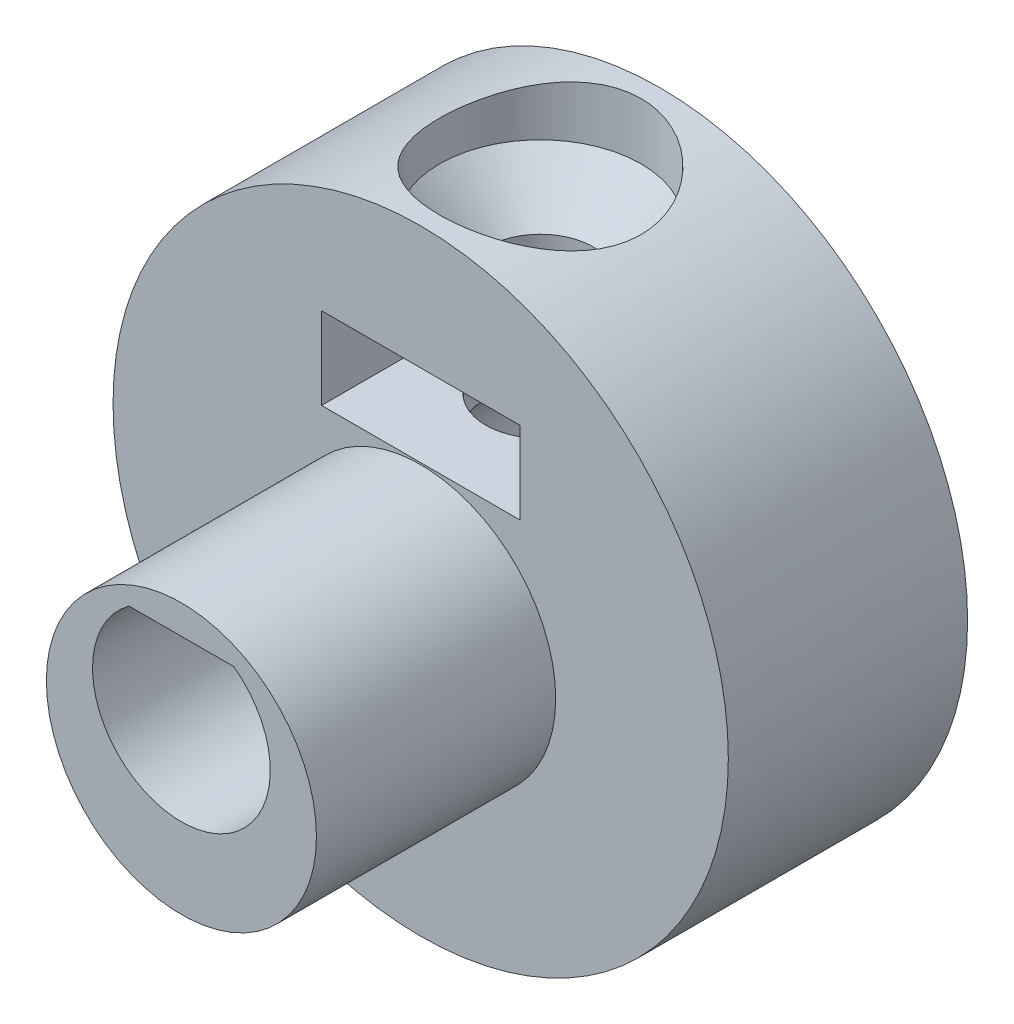
ISO-10303-21;
HEADER;
FILE_DESCRIPTION(('STEP AP214'),'2;1');
FILE_NAME('part.step','',(''),(''),'','','');
FILE_SCHEMA(('AUTOMOTIVE_DESIGN { 1 0 10303 214 1 1 1 1 }'));
ENDSEC;
DATA;
#1=APPLICATION_CONTEXT('core data for automotive mechanical design processes');
#2=APPLICATION_PROTOCOL_DEFINITION('international standard','automotive_design',2000,#1);
#3=PRODUCT_CONTEXT('',#1,'mechanical');
#4=PRODUCT('Part','Part','',(#3));
#5=PRODUCT_RELATED_PRODUCT_CATEGORY('part','',(#4));
#6=PRODUCT_DEFINITION_FORMATION('','',#4);
#7=PRODUCT_DEFINITION_CONTEXT('part definition',#1,'design');
#8=PRODUCT_DEFINITION('design','',#6,#7);
#9=PRODUCT_DEFINITION_SHAPE('','',#8);
#10=(LENGTH_UNIT() NAMED_UNIT(*) SI_UNIT(.MILLI.,.METRE.));
#11=(NAMED_UNIT(*) PLANE_ANGLE_UNIT() SI_UNIT($,.RADIAN.));
#12=(NAMED_UNIT(*) SI_UNIT($,.STERADIAN.) SOLID_ANGLE_UNIT());
#13=UNCERTAINTY_MEASURE_WITH_UNIT(LENGTH_MEASURE(1.E-05),#10,'distance_accuracy_value','');
#14=(GEOMETRIC_REPRESENTATION_CONTEXT(3) GLOBAL_UNCERTAINTY_ASSIGNED_CONTEXT((#13)) GLOBAL_UNIT_ASSIGNED_CONTEXT((#10,
#11,#12)) REPRESENTATION_CONTEXT('',''));
#15=CARTESIAN_POINT('',(0.,0.,0.));
#16=DIRECTION('',(0.,0.,1.));
#17=DIRECTION('',(1.,0.,0.));
#18=AXIS2_PLACEMENT_3D('',#15,#16,#17);
#19=CARTESIAN_POINT('',(0.,0.,7.));
#20=DIRECTION('',(0.,0.,-1.));
#21=DIRECTION('',(-1.,0.,0.));
#22=AXIS2_PLACEMENT_3D('',#19,#20,#21);
#23=CYLINDRICAL_SURFACE('',#22,9.);
#24=CARTESIAN_POINT('',(0.,0.,0.));
#25=DIRECTION('',(0.,0.,1.));
#26=DIRECTION('',(1.,0.,0.));
#27=AXIS2_PLACEMENT_3D('',#24,#25,#26);
#28=CIRCLE('',#27,9.);
#29=CARTESIAN_POINT('',(9.,0.,0.));
#30=VERTEX_POINT('',#29);
#31=EDGE_CURVE('E174',#30,#30,#28,.T.);
#32=ORIENTED_EDGE('',*,*,#31,.T.);
#33=EDGE_LOOP('',(#32));
#34=FACE_BOUND('',#33,.T.);
#35=CARTESIAN_POINT('',(0.,0.,7.));
#36=DIRECTION('',(0.,0.,1.));
#37=DIRECTION('',(1.,0.,0.));
#38=AXIS2_PLACEMENT_3D('',#35,#36,#37);
#39=CIRCLE('',#38,9.);
#40=CARTESIAN_POINT('',(9.,0.,7.));
#41=VERTEX_POINT('',#40);
#42=EDGE_CURVE('E173',#41,#41,#39,.T.);
#43=ORIENTED_EDGE('',*,*,#42,.F.);
#44=EDGE_LOOP('',(#43));
#45=FACE_BOUND('',#44,.T.);
#46=CARTESIAN_POINT('',(0.,9.,0.549999999999999));
#47=CARTESIAN_POINT('',(-0.161112811007833,9.00000007916726,0.54999977049622));
#48=CARTESIAN_POINT('',(-0.322225367097695,8.99563362612534,0.563241741495637));
#49=CARTESIAN_POINT('',(-0.639714101758699,8.97864445299604,0.615704018884045));
#50=CARTESIAN_POINT('',(-0.796089629614139,8.96602060394031,0.654927877580055));
#51=CARTESIAN_POINT('',(-1.09948106546237,8.9338903378811,0.757871411892351));
#52=CARTESIAN_POINT('',(-1.24651184971075,8.91439520081811,0.821550956193388));
#53=CARTESIAN_POINT('',(-1.5278071205778,8.87051846958465,0.971419731778327));
#54=CARTESIAN_POINT('',(-1.66206921513427,8.8461359624719,1.05761316948574));
#55=CARTESIAN_POINT('',(-1.91853006294912,8.7941396886032,1.25310842462129));
#56=CARTESIAN_POINT('',(-2.04023995666828,8.76645039345212,1.36303135956647));
#57=CARTESIAN_POINT('',(-2.26386852641767,8.71138271530213,1.6015442303979));
#58=CARTESIAN_POINT('',(-2.36578303447885,8.68400439892064,1.73013808755586));
#59=CARTESIAN_POINT('',(-2.54968005121513,8.63183317461184,2.00669741806998));
#60=CARTESIAN_POINT('',(-2.631033848366,8.60713263258936,2.1551000482303));
#61=CARTESIAN_POINT('',(-2.7674215834606,8.56425866139733,2.4644212261684));
#62=CARTESIAN_POINT('',(-2.82246325088888,8.54608331576893,2.62533608216929));
#63=CARTESIAN_POINT('',(-2.90284262108831,8.5191114809046,2.94956610485995));
#64=CARTESIAN_POINT('',(-2.92909390102087,8.51002738857174,3.11263016534748));
#65=CARTESIAN_POINT('',(-2.95400282249893,8.50141502328558,3.44108186491971));
#66=CARTESIAN_POINT('',(-2.95266865920405,8.50188391230561,3.60646879932786));
#67=CARTESIAN_POINT('',(-2.92315531108131,8.51207199397723,3.92714490348198));
#68=CARTESIAN_POINT('',(-2.89615979685309,8.52138329764801,4.0825582011845));
#69=CARTESIAN_POINT('',(-2.81801779864436,8.54754093512692,4.3865144345274));
#70=CARTESIAN_POINT('',(-2.76686851233264,8.564388143242,4.53505657077645));
#71=CARTESIAN_POINT('',(-2.64107962971505,8.60401589349913,4.82377855447869));
#72=CARTESIAN_POINT('',(-2.56608365084071,8.62688548385215,4.96379038525424));
#73=CARTESIAN_POINT('',(-2.39497765730034,8.67594291757715,5.22962012783346));
#74=CARTESIAN_POINT('',(-2.29886170733988,8.70213169285433,5.35543403455517));
#75=CARTESIAN_POINT('',(-2.08252564239994,8.75649002602446,5.59595905591665));
#76=CARTESIAN_POINT('',(-1.9613352172893,8.7846929094844,5.70979164547196));
#77=CARTESIAN_POINT('',(-1.70123660293618,8.83874511089937,5.91574266548827));
#78=CARTESIAN_POINT('',(-1.56232682670952,8.86459421768915,6.00785914889965));
#79=CARTESIAN_POINT('',(-1.26891586813371,8.9113464359935,6.16843942994575));
#80=CARTESIAN_POINT('',(-1.11428150287966,8.93220123179927,6.23667490593625));
#81=CARTESIAN_POINT('',(-0.794883071809848,8.96626492217254,6.34589534817572));
#82=CARTESIAN_POINT('',(-0.630122423815758,8.97947638101056,6.38688945434495));
#83=CARTESIAN_POINT('',(-0.302591104596022,8.99634333502784,6.43892343302898));
#84=CARTESIAN_POINT('',(-0.14002836040093,9.00037749384071,6.4511510100638));
#85=CARTESIAN_POINT('',(0.184854082755898,8.99956669104539,6.4486787042307));
#86=CARTESIAN_POINT('',(0.347173816925148,8.99472317243684,6.43398319750761));
#87=CARTESIAN_POINT('',(0.662255966733442,8.97695091784386,6.37902558440152));
#88=CARTESIAN_POINT('',(0.815158645178421,8.96425095616276,6.33948641414857));
#89=CARTESIAN_POINT('',(1.11210389443312,8.93227549763297,6.23686177314105));
#90=CARTESIAN_POINT('',(1.25614534057084,8.91299916813238,6.17377332065223));
#91=CARTESIAN_POINT('',(1.5354211202907,8.86921583836753,6.02403133094864));
#92=CARTESIAN_POINT('',(1.67033216354436,8.84458666910339,5.93681157481531));
#93=CARTESIAN_POINT('',(1.92399301280645,8.79289689700147,5.7419517805388));
#94=CARTESIAN_POINT('',(2.04273801157521,8.76583557487724,5.63430569096936));
#95=CARTESIAN_POINT('',(2.26611152862277,8.71083005315427,5.39606204597653));
#96=CARTESIAN_POINT('',(2.36989266209538,8.68289917663135,5.26466502468923));
#97=CARTESIAN_POINT('',(2.55402923310235,8.63053471650068,4.98571851729266));
#98=CARTESIAN_POINT('',(2.63438464853582,8.60610113619243,4.83816901594458));
#99=CARTESIAN_POINT('',(2.76897691698581,8.5637469605289,4.53115241548593));
#100=CARTESIAN_POINT('',(2.8232813381124,8.5458095461315,4.3717173997935));
#101=CARTESIAN_POINT('',(2.90404042015706,8.51870877247411,4.04524607888163));
#102=CARTESIAN_POINT('',(2.93050708321925,8.5095416320979,3.87821308193573));
#103=CARTESIAN_POINT('',(2.95392284015684,8.50143969717531,3.55021852780638));
#104=CARTESIAN_POINT('',(2.95227385305192,8.50201890479723,3.38936791272116));
#105=CARTESIAN_POINT('',(2.92293743458308,8.51214849552729,3.07036148285436));
#106=CARTESIAN_POINT('',(2.89525145705174,8.52169837773807,2.91220551811307));
#107=CARTESIAN_POINT('',(2.81560513690348,8.54833731543846,2.60586179994358));
#108=CARTESIAN_POINT('',(2.76408434262474,8.56528955565906,2.45754694744167));
#109=CARTESIAN_POINT('',(2.63858400839463,8.60477668462918,2.17155138978166));
#110=CARTESIAN_POINT('',(2.56459959011712,8.6273127858054,2.03387300265289));
#111=CARTESIAN_POINT('',(2.39260662902096,8.67662082423234,1.76672860818154));
#112=CARTESIAN_POINT('',(2.29371189186674,8.70353192207768,1.63785896591296));
#113=CARTESIAN_POINT('',(2.07622026061195,8.757959794638,1.39809096014739));
#114=CARTESIAN_POINT('',(1.95761788013916,8.78547673615692,1.28719761806815));
#115=CARTESIAN_POINT('',(1.69877526990235,8.83924483002503,1.08237856757061));
#116=CARTESIAN_POINT('',(1.55789411359646,8.86541078357923,0.989237760328904));
#117=CARTESIAN_POINT('',(1.2616242432928,8.91239325037381,0.828068321744328));
#118=CARTESIAN_POINT('',(1.10623981158641,8.93321133587649,0.760032307070647));
#119=CARTESIAN_POINT('',(0.794270731922598,8.9661780470715,0.654437448742746));
#120=CARTESIAN_POINT('',(0.63823247068608,8.97874409959837,0.615395259678429));
#121=CARTESIAN_POINT('',(0.32146191826884,8.99565399031255,0.563179941588874));
#122=CARTESIAN_POINT('',(0.160730832279097,8.99999992102044,0.550000228959653));
#123=CARTESIAN_POINT('',(0.,9.,0.549999999999999));
#124=B_SPLINE_CURVE_WITH_KNOTS('',3,(#46,#47,#48,#49,#50,#51,#52,#53,#54,#55,#56,#57,#58,#59,
#60,#61,#62,#63,#64,#65,#66,#67,#68,#69,#70,#71,#72,#73,#74,#75,#76,#77,#78,#79,#80,#81,#82,#83,
#84,#85,#86,#87,#88,#89,#90,#91,#92,#93,#94,#95,#96,#97,#98,#99,#100,#101,#102,#103,#104,#105,
#106,#107,#108,#109,#110,#111,#112,#113,#114,#115,#116,#117,#118,#119,#120,#121,#122,#123),
.UNSPECIFIED.,.T.,.F.,(4,2,2,2,2,2,2,2,2,2,2,2,2,2,2,2,2,2,2,2,2,2,2,2,2,2,2,2,2,2,2,2,2,2,2,2,
2,2,4),(0.,0.482747140063402,0.96556029611949,1.44758452715671,1.92969888255228,
2.42642310752843,2.92325180595637,3.43381151793208,3.94422115493364,4.43791863221509,
4.93146944259518,5.40330572496709,5.87519676344565,6.3545006419706,6.83393939077008,
7.33752888768181,7.84116351888875,8.34948958610246,8.85764501546994,9.34442072089788,
9.83111731161476,10.3042684747151,10.7774795670242,11.2629049562201,11.7484743808197,
12.2553370457081,12.7622001887922,13.2677414830955,13.7730647257241,14.2532683122651,
14.7334450871753,15.2050995694947,15.6768565522868,16.1686313865921,16.6605433552022,
17.1707592583502,17.6808249869457,18.1625502375705,18.6441528433309),.UNSPECIFIED.);
#125=CARTESIAN_POINT('',(0.,9.,0.549999999999999));
#126=VERTEX_POINT('',#125);
#127=EDGE_CURVE('E167',#126,#126,#124,.T.);
#128=ORIENTED_EDGE('',*,*,#127,.F.);
#129=EDGE_LOOP('',(#128));
#130=FACE_BOUND('',#129,.T.);
#131=ADVANCED_FACE('F39',(#34,#45,#130),#23,.T.);
#132=CARTESIAN_POINT('',(0.,3.,3.5));
#133=DIRECTION('',(0.,-1.,0.));
#134=DIRECTION('',(0.,0.,1.));
#135=AXIS2_PLACEMENT_3D('',#132,#133,#134);
#136=CONICAL_SURFACE('',#135,1.6,0.0174532925199433);
#137=CARTESIAN_POINT('',(0.,5.94288903149112,3.5));
#138=DIRECTION('',(0.,1.,0.));
#139=DIRECTION('',(0.,0.,1.));
#140=AXIS2_PLACEMENT_3D('',#137,#138,#139);
#141=CIRCLE('',#140,1.54863168087878);
#142=CARTESIAN_POINT('',(0.,5.94288903149112,5.04863168087878));
#143=VERTEX_POINT('',#142);
#144=EDGE_CURVE('E48',#143,#143,#141,.T.);
#145=ORIENTED_EDGE('',*,*,#144,.T.);
#146=EDGE_LOOP('',(#145));
#147=FACE_BOUND('',#146,.T.);
#148=CARTESIAN_POINT('',(0.,5.4,3.5));
#149=DIRECTION('',(0.,1.,0.));
#150=DIRECTION('',(0.,0.,1.));
#151=AXIS2_PLACEMENT_3D('',#148,#149,#150);
#152=CIRCLE('',#151,1.55810784417228);
#153=CARTESIAN_POINT('',(0.,5.4,5.05810784417228));
#154=VERTEX_POINT('',#153);
#155=EDGE_CURVE('E228',#154,#154,#152,.T.);
#156=ORIENTED_EDGE('',*,*,#155,.F.);
#157=EDGE_LOOP('',(#156));
#158=FACE_BOUND('',#157,.T.);
#159=ADVANCED_FACE('F165',(#147,#158),#136,.F.);
#160=CARTESIAN_POINT('',(0.,0.,7.));
#161=DIRECTION('',(0.,0.,1.));
#162=DIRECTION('',(1.,0.,0.));
#163=AXIS2_PLACEMENT_3D('',#160,#161,#162);
#164=PLANE('',#163);
#165=CARTESIAN_POINT('',(0.,-1.,7.));
#166=DIRECTION('',(0.,0.,1.));
#167=DIRECTION('',(1.,0.,0.));
#168=AXIS2_PLACEMENT_3D('',#165,#166,#167);
#169=CIRCLE('',#168,3.95);
#170=CARTESIAN_POINT('',(3.95,-1.,7.));
#171=VERTEX_POINT('',#170);
#172=EDGE_CURVE('E266',#171,#171,#169,.T.);
#173=ORIENTED_EDGE('',*,*,#172,.F.);
#174=EDGE_LOOP('',(#173));
#175=FACE_BOUND('',#174,.T.);
#176=DIRECTION('',(0.,1.,0.));
#177=VECTOR('',#176,1.);
#178=CARTESIAN_POINT('',(-2.9,3.,7.));
#179=LINE('',#178,#177);
#180=CARTESIAN_POINT('',(-2.9,3.,7.));
#181=VERTEX_POINT('',#180);
#182=CARTESIAN_POINT('',(-2.9,5.4,7.));
#183=VERTEX_POINT('',#182);
#184=EDGE_CURVE('E219',#181,#183,#179,.T.);
#185=ORIENTED_EDGE('',*,*,#184,.T.);
#186=DIRECTION('',(1.,0.,0.));
#187=VECTOR('',#186,1.);
#188=CARTESIAN_POINT('',(2.9,5.4,7.));
#189=LINE('',#188,#187);
#190=CARTESIAN_POINT('',(2.9,5.4,7.));
#191=VERTEX_POINT('',#190);
#192=EDGE_CURVE('E259',#183,#191,#189,.T.);
#193=ORIENTED_EDGE('',*,*,#192,.T.);
#194=DIRECTION('',(0.,-1.,0.));
#195=VECTOR('',#194,1.);
#196=CARTESIAN_POINT('',(2.9,3.,7.));
#197=LINE('',#196,#195);
#198=CARTESIAN_POINT('',(2.9,3.,7.));
#199=VERTEX_POINT('',#198);
#200=EDGE_CURVE('E255',#191,#199,#197,.T.);
#201=ORIENTED_EDGE('',*,*,#200,.T.);
#202=DIRECTION('',(-1.,0.,0.));
#203=VECTOR('',#202,1.);
#204=CARTESIAN_POINT('',(2.9,3.,7.));
#205=LINE('',#204,#203);
#206=EDGE_CURVE('E234',#199,#181,#205,.T.);
#207=ORIENTED_EDGE('',*,*,#206,.T.);
#208=EDGE_LOOP('',(#185,#193,#201,#207));
#209=FACE_BOUND('',#208,.T.);
#210=ORIENTED_EDGE('',*,*,#42,.T.);
#211=EDGE_LOOP('',(#210));
#212=FACE_BOUND('',#211,.T.);
#213=ADVANCED_FACE('F184',(#175,#209,#212),#164,.T.);
#214=CARTESIAN_POINT('',(0.,0.,0.));
#215=DIRECTION('',(0.,0.,1.));
#216=DIRECTION('',(1.,0.,0.));
#217=AXIS2_PLACEMENT_3D('',#214,#215,#216);
#218=PLANE('',#217);
#219=DIRECTION('',(1.,0.,0.));
#220=VECTOR('',#219,1.);
#221=CARTESIAN_POINT('',(1.53297097167559,2.1,0.));
#222=LINE('',#221,#220);
#223=CARTESIAN_POINT('',(-1.53297097167559,2.1,0.));
#224=VERTEX_POINT('',#223);
#225=CARTESIAN_POINT('',(1.53297097167559,2.1,0.));
#226=VERTEX_POINT('',#225);
#227=EDGE_CURVE('E122',#224,#226,#222,.T.);
#228=ORIENTED_EDGE('',*,*,#227,.F.);
#229=CARTESIAN_POINT('',(0.,0.,0.));
#230=DIRECTION('',(0.,0.,-1.));
#231=DIRECTION('',(-1.,0.,0.));
#232=AXIS2_PLACEMENT_3D('',#229,#230,#231);
#233=CIRCLE('',#232,2.6);
#234=EDGE_CURVE('E55',#226,#224,#233,.T.);
#235=ORIENTED_EDGE('',*,*,#234,.F.);
#236=EDGE_LOOP('',(#228,#235));
#237=FACE_BOUND('',#236,.T.);
#238=DIRECTION('',(1.,0.,0.));
#239=VECTOR('',#238,1.);
#240=CARTESIAN_POINT('',(2.9,5.4,0.));
#241=LINE('',#240,#239);
#242=CARTESIAN_POINT('',(-2.9,5.4,0.));
#243=VERTEX_POINT('',#242);
#244=CARTESIAN_POINT('',(2.9,5.4,0.));
#245=VERTEX_POINT('',#244);
#246=EDGE_CURVE('E226',#243,#245,#241,.T.);
#247=ORIENTED_EDGE('',*,*,#246,.F.);
#248=DIRECTION('',(0.,1.,0.));
#249=VECTOR('',#248,1.);
#250=CARTESIAN_POINT('',(-2.9,3.,0.));
#251=LINE('',#250,#249);
#252=CARTESIAN_POINT('',(-2.9,3.,0.));
#253=VERTEX_POINT('',#252);
#254=EDGE_CURVE('E223',#253,#243,#251,.T.);
#255=ORIENTED_EDGE('',*,*,#254,.F.);
#256=DIRECTION('',(-1.,0.,0.));
#257=VECTOR('',#256,1.);
#258=CARTESIAN_POINT('',(2.9,3.,0.));
#259=LINE('',#258,#257);
#260=CARTESIAN_POINT('',(2.9,3.,0.));
#261=VERTEX_POINT('',#260);
#262=EDGE_CURVE('E210',#261,#253,#259,.T.);
#263=ORIENTED_EDGE('',*,*,#262,.F.);
#264=DIRECTION('',(0.,-1.,0.));
#265=VECTOR('',#264,1.);
#266=CARTESIAN_POINT('',(2.9,3.,0.));
#267=LINE('',#266,#265);
#268=EDGE_CURVE('E220',#245,#261,#267,.T.);
#269=ORIENTED_EDGE('',*,*,#268,.F.);
#270=EDGE_LOOP('',(#247,#255,#263,#269));
#271=FACE_BOUND('',#270,.T.);
#272=ORIENTED_EDGE('',*,*,#31,.F.);
#273=EDGE_LOOP('',(#272));
#274=FACE_BOUND('',#273,.T.);
#275=ADVANCED_FACE('F180',(#237,#271,#274),#218,.F.);
#276=CARTESIAN_POINT('',(-2.9,3.,7.));
#277=DIRECTION('',(-1.,0.,0.));
#278=DIRECTION('',(0.,0.,1.));
#279=AXIS2_PLACEMENT_3D('',#276,#277,#278);
#280=PLANE('',#279);
#281=ORIENTED_EDGE('',*,*,#254,.T.);
#282=DIRECTION('',(0.,0.,-1.));
#283=VECTOR('',#282,1.);
#284=CARTESIAN_POINT('',(-2.9,5.4,7.));
#285=LINE('',#284,#283);
#286=EDGE_CURVE('E242',#183,#243,#285,.T.);
#287=ORIENTED_EDGE('',*,*,#286,.F.);
#288=ORIENTED_EDGE('',*,*,#184,.F.);
#289=DIRECTION('',(0.,0.,-1.));
#290=VECTOR('',#289,1.);
#291=CARTESIAN_POINT('',(-2.9,3.,7.));
#292=LINE('',#291,#290);
#293=EDGE_CURVE('E213',#181,#253,#292,.T.);
#294=ORIENTED_EDGE('',*,*,#293,.T.);
#295=EDGE_LOOP('',(#281,#287,#288,#294));
#296=FACE_BOUND('',#295,.T.);
#297=ADVANCED_FACE('F183',(#296),#280,.F.);
#298=CARTESIAN_POINT('',(2.9,3.,7.));
#299=DIRECTION('',(0.,-1.,0.));
#300=DIRECTION('',(0.,0.,-1.));
#301=AXIS2_PLACEMENT_3D('',#298,#299,#300);
#302=PLANE('',#301);
#303=CARTESIAN_POINT('',(0.,3.,3.5));
#304=DIRECTION('',(0.,1.,0.));
#305=DIRECTION('',(0.,0.,1.));
#306=AXIS2_PLACEMENT_3D('',#303,#304,#305);
#307=CIRCLE('',#306,1.6);
#308=CARTESIAN_POINT('',(0.,3.,5.1));
#309=VERTEX_POINT('',#308);
#310=EDGE_CURVE('E207',#309,#309,#307,.T.);
#311=ORIENTED_EDGE('',*,*,#310,.F.);
#312=EDGE_LOOP('',(#311));
#313=FACE_BOUND('',#312,.T.);
#314=ORIENTED_EDGE('',*,*,#262,.T.);
#315=ORIENTED_EDGE('',*,*,#293,.F.);
#316=ORIENTED_EDGE('',*,*,#206,.F.);
#317=DIRECTION('',(0.,0.,-1.));
#318=VECTOR('',#317,1.);
#319=CARTESIAN_POINT('',(2.9,3.,7.));
#320=LINE('',#319,#318);
#321=EDGE_CURVE('E215',#199,#261,#320,.T.);
#322=ORIENTED_EDGE('',*,*,#321,.T.);
#323=EDGE_LOOP('',(#314,#315,#316,#322));
#324=FACE_BOUND('',#323,.T.);
#325=ADVANCED_FACE('F191',(#313,#324),#302,.F.);
#326=CARTESIAN_POINT('',(2.9,3.,7.));
#327=DIRECTION('',(1.,0.,0.));
#328=DIRECTION('',(0.,0.,-1.));
#329=AXIS2_PLACEMENT_3D('',#326,#327,#328);
#330=PLANE('',#329);
#331=ORIENTED_EDGE('',*,*,#268,.T.);
#332=ORIENTED_EDGE('',*,*,#321,.F.);
#333=ORIENTED_EDGE('',*,*,#200,.F.);
#334=DIRECTION('',(0.,0.,-1.));
#335=VECTOR('',#334,1.);
#336=CARTESIAN_POINT('',(2.9,5.4,7.));
#337=LINE('',#336,#335);
#338=EDGE_CURVE('E240',#191,#245,#337,.T.);
#339=ORIENTED_EDGE('',*,*,#338,.T.);
#340=EDGE_LOOP('',(#331,#332,#333,#339));
#341=FACE_BOUND('',#340,.T.);
#342=ADVANCED_FACE('F196',(#341),#330,.F.);
#343=CARTESIAN_POINT('',(2.9,5.4,7.));
#344=DIRECTION('',(0.,1.,0.));
#345=DIRECTION('',(0.,0.,1.));
#346=AXIS2_PLACEMENT_3D('',#343,#344,#345);
#347=PLANE('',#346);
#348=ORIENTED_EDGE('',*,*,#155,.T.);
#349=EDGE_LOOP('',(#348));
#350=FACE_BOUND('',#349,.T.);
#351=ORIENTED_EDGE('',*,*,#246,.T.);
#352=ORIENTED_EDGE('',*,*,#338,.F.);
#353=ORIENTED_EDGE('',*,*,#192,.F.);
#354=ORIENTED_EDGE('',*,*,#286,.T.);
#355=EDGE_LOOP('',(#351,#352,#353,#354));
#356=FACE_BOUND('',#355,.T.);
#357=ADVANCED_FACE('F193',(#350,#356),#347,.F.);
#358=CARTESIAN_POINT('',(0.,3.,3.5));
#359=DIRECTION('',(0.,1.,0.));
#360=DIRECTION('',(0.,0.,1.));
#361=AXIS2_PLACEMENT_3D('',#358,#359,#360);
#362=CONICAL_SURFACE('',#361,1.6,0.0174532925199433);
#363=CARTESIAN_POINT('',(-1.29899889188882,2.25224374321955,4.41159498036883));
#364=CARTESIAN_POINT('',(-1.32529165431759,2.23708154011111,4.37364772010008));
#365=CARTESIAN_POINT('',(-1.34999117940577,2.22222007099547,4.33450834879584));
#366=CARTESIAN_POINT('',(-1.39607472859892,2.193560949725,4.25385868117236));
#367=CARTESIAN_POINT('',(-1.41745289154597,2.17976519931486,4.21234436650791));
#368=CARTESIAN_POINT('',(-1.47641579831923,2.14066239412542,4.08417181398737));
#369=CARTESIAN_POINT('',(-1.50864564564679,2.11775085211648,3.99414606408818));
#370=CARTESIAN_POINT('',(-1.55094764478245,2.08688200923848,3.83037630681194));
#371=CARTESIAN_POINT('',(-1.56448903050259,2.07665077013112,3.75794198569285));
#372=CARTESIAN_POINT('',(-1.58143943046514,2.06377602516573,3.61145008782872));
#373=CARTESIAN_POINT('',(-1.58488772820832,2.06110310282041,3.53739993766193));
#374=CARTESIAN_POINT('',(-1.58181370413459,2.06345816193232,3.40173737158732));
#375=CARTESIAN_POINT('',(-1.57682189512963,2.06730429099622,3.34006097809845));
#376=CARTESIAN_POINT('',(-1.55988407897795,2.08011365641698,3.21816430050291));
#377=CARTESIAN_POINT('',(-1.54792987145782,2.08908292661326,3.15794582079964));
#378=CARTESIAN_POINT('',(-1.5100856291588,2.11670188305626,3.0114209362597));
#379=CARTESIAN_POINT('',(-1.48025011876776,2.13793615633245,2.92660653463172));
#380=CARTESIAN_POINT('',(-1.40768206888462,2.18639588599553,2.76438219776849));
#381=CARTESIAN_POINT('',(-1.36490905135751,2.21364007232302,2.68699652090901));
#382=CARTESIAN_POINT('',(-1.27069770003565,2.26894728553857,2.545295470627));
#383=CARTESIAN_POINT('',(-1.21992672611327,2.29686503791386,2.48047628161313));
#384=CARTESIAN_POINT('',(-1.10927853077408,2.35230719826049,2.35978872465429));
#385=CARTESIAN_POINT('',(-1.04946048459482,2.37983297534036,2.30386671387855));
#386=CARTESIAN_POINT('',(-0.985350042403645,2.40605180616194,2.25259586208519));
#387=B_SPLINE_CURVE_WITH_KNOTS('',3,(#363,#364,#365,#366,#367,#368,#369,#370,#371,#372,#373,
#374,#375,#376,#377,#378,#379,#380,#381,#382,#383,#384,#385,#386),.UNSPECIFIED.,.F.,.F.,(4,2,2,
2,2,2,2,2,2,2,2,4),(0.,0.14567555687697,0.291605334645399,0.584466931415316,0.806697055308567,
1.02806107533898,1.2134198288775,1.39899734232891,1.67446358398311,1.95080076170907,
2.21068891932228,2.46894536132098),.UNSPECIFIED.);
#388=CARTESIAN_POINT('',(-1.53297097167559,2.1,3.8999702529351));
#389=VERTEX_POINT('',#388);
#390=CARTESIAN_POINT('',(-1.53297097167559,2.1,3.1000297470649));
#391=VERTEX_POINT('',#390);
#392=EDGE_CURVE('E109',#389,#391,#387,.T.);
#393=ORIENTED_EDGE('',*,*,#392,.T.);
#394=CARTESIAN_POINT('',(0.,2.1,3.5));
#395=DIRECTION('',(0.,1.,0.));
#396=DIRECTION('',(0.,0.,1.));
#397=AXIS2_PLACEMENT_3D('',#394,#395,#396);
#398=CIRCLE('',#397,1.5842904415646);
#399=CARTESIAN_POINT('',(1.53297097167559,2.1,3.1000297470649));
#400=VERTEX_POINT('',#399);
#401=EDGE_CURVE('E131',#391,#400,#398,.F.);
#402=ORIENTED_EDGE('',*,*,#401,.T.);
#403=CARTESIAN_POINT('',(0.985350042403645,2.40605180616194,2.25259586208519));
#404=CARTESIAN_POINT('',(1.02154551243846,2.39122975680895,2.28152571547052));
#405=CARTESIAN_POINT('',(1.05635452493864,2.37601890424595,2.31193404395024));
#406=CARTESIAN_POINT('',(1.12310876668972,2.34520336992881,2.37558186990055));
#407=CARTESIAN_POINT('',(1.155053338377,2.3295985987946,2.4088220140475));
#408=CARTESIAN_POINT('',(1.24664915844123,2.28266767059601,2.51282924019872));
#409=CARTESIAN_POINT('',(1.30180060998841,2.25133710751815,2.58767314383147));
#410=CARTESIAN_POINT('',(1.39051762173335,2.19742796152881,2.73330612555232));
#411=CARTESIAN_POINT('',(1.42615790985264,2.17426633535342,2.80262899736109));
#412=CARTESIAN_POINT('',(1.48728023123605,2.13292279300558,2.94691372741787));
#413=CARTESIAN_POINT('',(1.51278491489995,2.11472980205201,3.02186256202493));
#414=CARTESIAN_POINT('',(1.5509079288495,2.08691146671237,3.16948485809888));
#415=CARTESIAN_POINT('',(1.56444099267889,2.07668697050567,3.24180571560757));
#416=CARTESIAN_POINT('',(1.58142951220879,2.06378386708415,3.38830265006232));
#417=CARTESIAN_POINT('',(1.58489007557295,2.06110143538778,3.46247776747814));
#418=CARTESIAN_POINT('',(1.58181268951233,2.06345882969851,3.59832305440763));
#419=CARTESIAN_POINT('',(1.57681450019605,2.0673096947679,3.66005820610279));
#420=CARTESIAN_POINT('',(1.55985672827829,2.08013453234658,3.781966432603));
#421=CARTESIAN_POINT('',(1.54790317102363,2.08910407048528,3.84214081241315));
#422=CARTESIAN_POINT('',(1.52218002996898,2.10787416982543,3.94176368871473));
#423=CARTESIAN_POINT('',(1.51010723197609,2.11656547473556,3.98188116094026));
#424=CARTESIAN_POINT('',(1.47248668715091,2.14304731073429,4.09127904543607));
#425=CARTESIAN_POINT('',(1.44375119124396,2.16266609549848,4.15903928005033));
#426=CARTESIAN_POINT('',(1.37765082379246,2.20536443232144,4.28947413558931));
#427=CARTESIAN_POINT('',(1.34024799852757,2.22845904418289,4.35212470078833));
#428=CARTESIAN_POINT('',(1.29899889188882,2.25224374321955,4.41159498036883));
#429=B_SPLINE_CURVE_WITH_KNOTS('',3,(#403,#404,#405,#406,#407,#408,#409,#410,#411,#412,#413,
#414,#415,#416,#417,#418,#419,#420,#421,#422,#423,#424,#425,#426,#427,#428),.UNSPECIFIED.,.F.,
.F.,(4,2,2,2,2,2,2,2,2,2,2,2,4),(0.,0.145839908593675,0.291713211074393,0.584509037161942,
0.82763183354986,1.07020821752694,1.29206150517315,1.51380227363294,1.69935064092087,
1.88473850882205,2.01295651704791,2.24064395716491,2.46934792476753),.UNSPECIFIED.);
#430=CARTESIAN_POINT('',(1.53297097167559,2.1,3.8999702529351));
#431=VERTEX_POINT('',#430);
#432=EDGE_CURVE('E139',#400,#431,#429,.T.);
#433=ORIENTED_EDGE('',*,*,#432,.T.);
#434=EDGE_CURVE('E128',#431,#389,#398,.F.);
#435=ORIENTED_EDGE('',*,*,#434,.T.);
#436=EDGE_LOOP('',(#393,#402,#433,#435));
#437=FACE_BOUND('',#436,.T.);
#438=ORIENTED_EDGE('',*,*,#310,.T.);
#439=EDGE_LOOP('',(#438));
#440=FACE_BOUND('',#439,.T.);
#441=ADVANCED_FACE('F145',(#437,#440),#362,.F.);
#442=CARTESIAN_POINT('',(0.,9.,3.5));
#443=DIRECTION('',(0.,-1.,0.));
#444=DIRECTION('',(0.,0.,-1.));
#445=AXIS2_PLACEMENT_3D('',#442,#443,#444);
#446=CYLINDRICAL_SURFACE('',#445,2.95);
#447=CARTESIAN_POINT('',(0.,7.34425735061235,3.5));
#448=DIRECTION('',(0.,1.,0.));
#449=DIRECTION('',(0.,0.,1.));
#450=AXIS2_PLACEMENT_3D('',#447,#448,#449);
#451=CIRCLE('',#450,2.95);
#452=CARTESIAN_POINT('',(0.,7.34425735061235,6.45));
#453=VERTEX_POINT('',#452);
#454=EDGE_CURVE('E11',#453,#453,#451,.F.);
#455=ORIENTED_EDGE('',*,*,#454,.T.);
#456=EDGE_LOOP('',(#455));
#457=FACE_BOUND('',#456,.T.);
#458=ORIENTED_EDGE('',*,*,#127,.T.);
#459=EDGE_LOOP('',(#458));
#460=FACE_BOUND('',#459,.T.);
#461=ADVANCED_FACE('F161',(#457,#460),#446,.F.);
#462=CARTESIAN_POINT('',(0.,5.94288903149111,3.5));
#463=DIRECTION('',(0.,1.,0.));
#464=DIRECTION('',(0.,0.,1.));
#465=AXIS2_PLACEMENT_3D('',#462,#463,#464);
#466=CONICAL_SURFACE('',#465,1.54863168087878,0.785398163397443);
#467=ORIENTED_EDGE('',*,*,#454,.F.);
#468=EDGE_LOOP('',(#467));
#469=FACE_BOUND('',#468,.T.);
#470=ORIENTED_EDGE('',*,*,#144,.F.);
#471=EDGE_LOOP('',(#470));
#472=FACE_BOUND('',#471,.T.);
#473=ADVANCED_FACE('F42',(#469,#472),#466,.F.);
#474=CARTESIAN_POINT('',(0.,-1.,14.));
#475=DIRECTION('',(0.,0.,-1.));
#476=DIRECTION('',(-1.,0.,0.));
#477=AXIS2_PLACEMENT_3D('',#474,#475,#476);
#478=CYLINDRICAL_SURFACE('',#477,3.95);
#479=CARTESIAN_POINT('',(0.,-1.,14.));
#480=DIRECTION('',(0.,0.,1.));
#481=DIRECTION('',(1.,0.,0.));
#482=AXIS2_PLACEMENT_3D('',#479,#480,#481);
#483=CIRCLE('',#482,3.95);
#484=CARTESIAN_POINT('',(3.95,-1.,14.));
#485=VERTEX_POINT('',#484);
#486=EDGE_CURVE('E264',#485,#485,#483,.T.);
#487=ORIENTED_EDGE('',*,*,#486,.F.);
#488=EDGE_LOOP('',(#487));
#489=FACE_BOUND('',#488,.T.);
#490=ORIENTED_EDGE('',*,*,#172,.T.);
#491=EDGE_LOOP('',(#490));
#492=FACE_BOUND('',#491,.T.);
#493=ADVANCED_FACE('F157',(#489,#492),#478,.T.);
#494=CARTESIAN_POINT('',(0.,-1.,14.));
#495=DIRECTION('',(0.,0.,1.));
#496=DIRECTION('',(1.,0.,0.));
#497=AXIS2_PLACEMENT_3D('',#494,#495,#496);
#498=PLANE('',#497);
#499=CARTESIAN_POINT('',(0.,0.,14.));
#500=DIRECTION('',(0.,0.,-1.));
#501=DIRECTION('',(-1.,0.,0.));
#502=AXIS2_PLACEMENT_3D('',#499,#500,#501);
#503=CIRCLE('',#502,2.6);
#504=CARTESIAN_POINT('',(1.53297097167559,2.1,14.));
#505=VERTEX_POINT('',#504);
#506=CARTESIAN_POINT('',(-1.53297097167559,2.1,14.));
#507=VERTEX_POINT('',#506);
#508=EDGE_CURVE('E106',#505,#507,#503,.T.);
#509=ORIENTED_EDGE('',*,*,#508,.T.);
#510=DIRECTION('',(1.,0.,0.));
#511=VECTOR('',#510,1.);
#512=CARTESIAN_POINT('',(1.53297097167559,2.1,14.));
#513=LINE('',#512,#511);
#514=EDGE_CURVE('E115',#507,#505,#513,.T.);
#515=ORIENTED_EDGE('',*,*,#514,.T.);
#516=EDGE_LOOP('',(#509,#515));
#517=FACE_BOUND('',#516,.T.);
#518=ORIENTED_EDGE('',*,*,#486,.T.);
#519=EDGE_LOOP('',(#518));
#520=FACE_BOUND('',#519,.T.);
#521=ADVANCED_FACE('F120',(#517,#520),#498,.T.);
#522=CARTESIAN_POINT('',(0.,0.,14.));
#523=DIRECTION('',(0.,0.,-1.));
#524=DIRECTION('',(-1.,0.,0.));
#525=AXIS2_PLACEMENT_3D('',#522,#523,#524);
#526=CYLINDRICAL_SURFACE('',#525,2.6);
#527=DIRECTION('',(0.,0.,-1.));
#528=VECTOR('',#527,1.);
#529=CARTESIAN_POINT('',(1.53297097167559,2.1,14.));
#530=LINE('',#529,#528);
#531=EDGE_CURVE('E111',#400,#226,#530,.T.);
#532=ORIENTED_EDGE('',*,*,#531,.T.);
#533=ORIENTED_EDGE('',*,*,#234,.T.);
#534=DIRECTION('',(0.,0.,-1.));
#535=VECTOR('',#534,1.);
#536=CARTESIAN_POINT('',(-1.53297097167559,2.1,14.));
#537=LINE('',#536,#535);
#538=EDGE_CURVE('E112',#391,#224,#537,.T.);
#539=ORIENTED_EDGE('',*,*,#538,.F.);
#540=ORIENTED_EDGE('',*,*,#392,.F.);
#541=EDGE_CURVE('E63',#507,#389,#537,.T.);
#542=ORIENTED_EDGE('',*,*,#541,.F.);
#543=ORIENTED_EDGE('',*,*,#508,.F.);
#544=EDGE_CURVE('E117',#505,#431,#530,.T.);
#545=ORIENTED_EDGE('',*,*,#544,.T.);
#546=ORIENTED_EDGE('',*,*,#432,.F.);
#547=EDGE_LOOP('',(#532,#533,#539,#540,#542,#543,#545,#546));
#548=FACE_BOUND('',#547,.T.);
#549=ADVANCED_FACE('F103',(#548),#526,.F.);
#550=CARTESIAN_POINT('',(1.53297097167559,2.1,14.));
#551=DIRECTION('',(0.,1.,0.));
#552=DIRECTION('',(0.,0.,1.));
#553=AXIS2_PLACEMENT_3D('',#550,#551,#552);
#554=PLANE('',#553);
#555=ORIENTED_EDGE('',*,*,#538,.T.);
#556=ORIENTED_EDGE('',*,*,#227,.T.);
#557=ORIENTED_EDGE('',*,*,#531,.F.);
#558=ORIENTED_EDGE('',*,*,#401,.F.);
#559=EDGE_LOOP('',(#555,#556,#557,#558));
#560=FACE_BOUND('',#559,.T.);
#561=ADVANCED_FACE('F153',(#560),#554,.F.);
#562=ORIENTED_EDGE('',*,*,#544,.F.);
#563=ORIENTED_EDGE('',*,*,#514,.F.);
#564=ORIENTED_EDGE('',*,*,#541,.T.);
#565=ORIENTED_EDGE('',*,*,#434,.F.);
#566=EDGE_LOOP('',(#562,#563,#564,#565));
#567=FACE_BOUND('',#566,.T.);
#568=ADVANCED_FACE('F116',(#567),#554,.F.);
#569=CLOSED_SHELL('',(#131,#159,#213,#275,#297,#325,#342,#357,#441,#461,#473,#493,#521,#549,
#561,#568));
#570=MANIFOLD_SOLID_BREP('B2',#569);
#571=ADVANCED_BREP_SHAPE_REPRESENTATION('',(#18,#570),#14);
#572=SHAPE_DEFINITION_REPRESENTATION(#9,#571);
ENDSEC;
END-ISO-10303-21;
